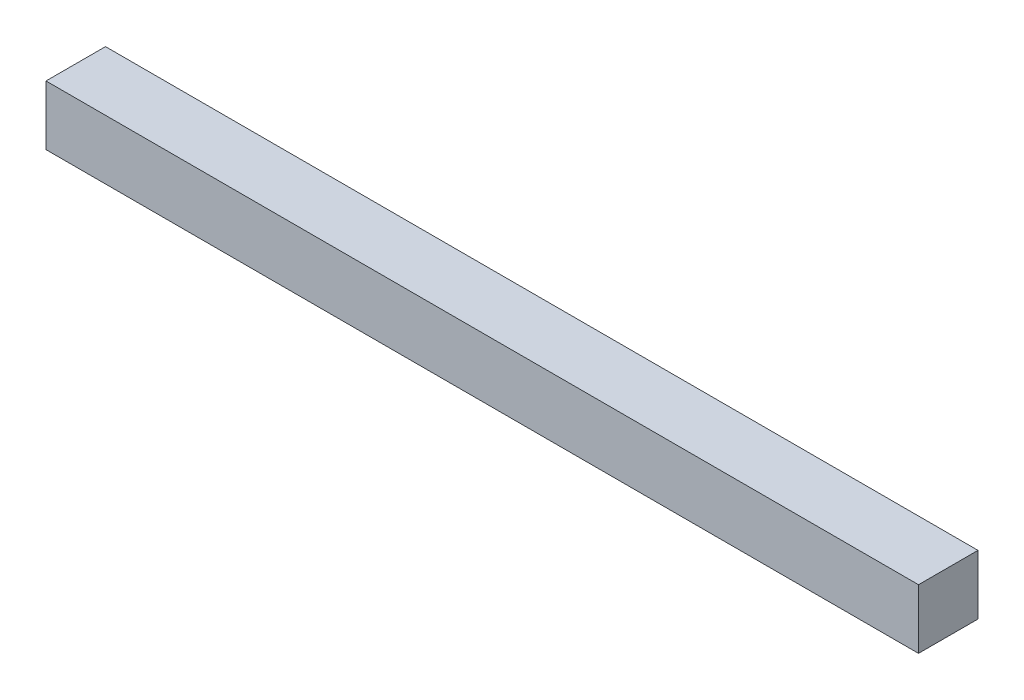
ISO-10303-21;
HEADER;
FILE_DESCRIPTION(('STEP AP214'),'2;1');
FILE_NAME('part.step','',(''),(''),'','','');
FILE_SCHEMA(('AUTOMOTIVE_DESIGN { 1 0 10303 214 1 1 1 1 }'));
ENDSEC;
DATA;
#1=APPLICATION_CONTEXT('core data for automotive mechanical design processes');
#2=APPLICATION_PROTOCOL_DEFINITION('international standard','automotive_design',2000,#1);
#3=PRODUCT_CONTEXT('',#1,'mechanical');
#4=PRODUCT('Part','Part','',(#3));
#5=PRODUCT_RELATED_PRODUCT_CATEGORY('part','',(#4));
#6=PRODUCT_DEFINITION_FORMATION('','',#4);
#7=PRODUCT_DEFINITION_CONTEXT('part definition',#1,'design');
#8=PRODUCT_DEFINITION('design','',#6,#7);
#9=PRODUCT_DEFINITION_SHAPE('','',#8);
#10=(LENGTH_UNIT() NAMED_UNIT(*) SI_UNIT(.MILLI.,.METRE.));
#11=(NAMED_UNIT(*) PLANE_ANGLE_UNIT() SI_UNIT($,.RADIAN.));
#12=(NAMED_UNIT(*) SI_UNIT($,.STERADIAN.) SOLID_ANGLE_UNIT());
#13=UNCERTAINTY_MEASURE_WITH_UNIT(LENGTH_MEASURE(1.E-05),#10,'distance_accuracy_value','');
#14=(GEOMETRIC_REPRESENTATION_CONTEXT(3) GLOBAL_UNCERTAINTY_ASSIGNED_CONTEXT((#13)) GLOBAL_UNIT_ASSIGNED_CONTEXT((#10,
#11,#12)) REPRESENTATION_CONTEXT('',''));
#15=CARTESIAN_POINT('',(0.,0.,0.));
#16=DIRECTION('',(0.,0.,1.));
#17=DIRECTION('',(1.,0.,0.));
#18=AXIS2_PLACEMENT_3D('',#15,#16,#17);
#19=CARTESIAN_POINT('',(0.,150.,150.));
#20=DIRECTION('',(1.,0.,0.));
#21=DIRECTION('',(0.,1.,0.));
#22=AXIS2_PLACEMENT_3D('',#19,#20,#21);
#23=PLANE('',#22);
#24=DIRECTION('',(0.,-1.,0.));
#25=VECTOR('',#24,1.);
#26=CARTESIAN_POINT('',(0.,150.,0.));
#27=LINE('',#26,#25);
#28=CARTESIAN_POINT('',(0.,150.,0.));
#29=VERTEX_POINT('',#28);
#30=CARTESIAN_POINT('',(0.,0.,0.));
#31=VERTEX_POINT('',#30);
#32=EDGE_CURVE('E95',#29,#31,#27,.T.);
#33=ORIENTED_EDGE('',*,*,#32,.T.);
#34=DIRECTION('',(0.,0.,-1.));
#35=VECTOR('',#34,1.);
#36=CARTESIAN_POINT('',(0.,0.,150.));
#37=LINE('',#36,#35);
#38=CARTESIAN_POINT('',(0.,0.,150.));
#39=VERTEX_POINT('',#38);
#40=EDGE_CURVE('E11',#39,#31,#37,.T.);
#41=ORIENTED_EDGE('',*,*,#40,.F.);
#42=DIRECTION('',(0.,-1.,0.));
#43=VECTOR('',#42,1.);
#44=CARTESIAN_POINT('',(0.,150.,150.));
#45=LINE('',#44,#43);
#46=CARTESIAN_POINT('',(0.,150.,150.));
#47=VERTEX_POINT('',#46);
#48=EDGE_CURVE('E83',#47,#39,#45,.T.);
#49=ORIENTED_EDGE('',*,*,#48,.F.);
#50=DIRECTION('',(0.,0.,-1.));
#51=VECTOR('',#50,1.);
#52=CARTESIAN_POINT('',(0.,150.,150.));
#53=LINE('',#52,#51);
#54=EDGE_CURVE('E91',#47,#29,#53,.T.);
#55=ORIENTED_EDGE('',*,*,#54,.T.);
#56=EDGE_LOOP('',(#33,#41,#49,#55));
#57=FACE_BOUND('',#56,.T.);
#58=ADVANCED_FACE('F32',(#57),#23,.F.);
#59=CARTESIAN_POINT('',(0.,0.,150.));
#60=DIRECTION('',(0.,1.,0.));
#61=DIRECTION('',(0.,0.,1.));
#62=AXIS2_PLACEMENT_3D('',#59,#60,#61);
#63=PLANE('',#62);
#64=DIRECTION('',(1.,0.,0.));
#65=VECTOR('',#64,1.);
#66=CARTESIAN_POINT('',(0.,0.,0.));
#67=LINE('',#66,#65);
#68=CARTESIAN_POINT('',(2200.,0.,0.));
#69=VERTEX_POINT('',#68);
#70=EDGE_CURVE('E87',#31,#69,#67,.T.);
#71=ORIENTED_EDGE('',*,*,#70,.T.);
#72=DIRECTION('',(0.,0.,-1.));
#73=VECTOR('',#72,1.);
#74=CARTESIAN_POINT('',(2200.,0.,150.));
#75=LINE('',#74,#73);
#76=CARTESIAN_POINT('',(2200.,0.,150.));
#77=VERTEX_POINT('',#76);
#78=EDGE_CURVE('E40',#77,#69,#75,.T.);
#79=ORIENTED_EDGE('',*,*,#78,.F.);
#80=DIRECTION('',(1.,0.,0.));
#81=VECTOR('',#80,1.);
#82=CARTESIAN_POINT('',(0.,0.,150.));
#83=LINE('',#82,#81);
#84=EDGE_CURVE('E78',#39,#77,#83,.T.);
#85=ORIENTED_EDGE('',*,*,#84,.F.);
#86=ORIENTED_EDGE('',*,*,#40,.T.);
#87=EDGE_LOOP('',(#71,#79,#85,#86));
#88=FACE_BOUND('',#87,.T.);
#89=ADVANCED_FACE('F86',(#88),#63,.F.);
#90=CARTESIAN_POINT('',(2200.,150.,150.));
#91=DIRECTION('',(-1.,0.,0.));
#92=DIRECTION('',(0.,0.,1.));
#93=AXIS2_PLACEMENT_3D('',#90,#91,#92);
#94=PLANE('',#93);
#95=DIRECTION('',(0.,1.,0.));
#96=VECTOR('',#95,1.);
#97=CARTESIAN_POINT('',(2200.,150.,0.));
#98=LINE('',#97,#96);
#99=CARTESIAN_POINT('',(2200.,150.,0.));
#100=VERTEX_POINT('',#99);
#101=EDGE_CURVE('E65',#69,#100,#98,.T.);
#102=ORIENTED_EDGE('',*,*,#101,.T.);
#103=DIRECTION('',(0.,0.,-1.));
#104=VECTOR('',#103,1.);
#105=CARTESIAN_POINT('',(2200.,150.,150.));
#106=LINE('',#105,#104);
#107=CARTESIAN_POINT('',(2200.,150.,150.));
#108=VERTEX_POINT('',#107);
#109=EDGE_CURVE('E88',#108,#100,#106,.T.);
#110=ORIENTED_EDGE('',*,*,#109,.F.);
#111=DIRECTION('',(0.,1.,0.));
#112=VECTOR('',#111,1.);
#113=CARTESIAN_POINT('',(2200.,150.,150.));
#114=LINE('',#113,#112);
#115=EDGE_CURVE('E81',#77,#108,#114,.T.);
#116=ORIENTED_EDGE('',*,*,#115,.F.);
#117=ORIENTED_EDGE('',*,*,#78,.T.);
#118=EDGE_LOOP('',(#102,#110,#116,#117));
#119=FACE_BOUND('',#118,.T.);
#120=ADVANCED_FACE('F89',(#119),#94,.F.);
#121=CARTESIAN_POINT('',(0.,150.,150.));
#122=DIRECTION('',(0.,-1.,0.));
#123=DIRECTION('',(0.,0.,-1.));
#124=AXIS2_PLACEMENT_3D('',#121,#122,#123);
#125=PLANE('',#124);
#126=DIRECTION('',(-1.,0.,0.));
#127=VECTOR('',#126,1.);
#128=CARTESIAN_POINT('',(0.,150.,0.));
#129=LINE('',#128,#127);
#130=EDGE_CURVE('E71',#100,#29,#129,.T.);
#131=ORIENTED_EDGE('',*,*,#130,.T.);
#132=ORIENTED_EDGE('',*,*,#54,.F.);
#133=DIRECTION('',(-1.,0.,0.));
#134=VECTOR('',#133,1.);
#135=CARTESIAN_POINT('',(0.,150.,150.));
#136=LINE('',#135,#134);
#137=EDGE_CURVE('E48',#108,#47,#136,.T.);
#138=ORIENTED_EDGE('',*,*,#137,.F.);
#139=ORIENTED_EDGE('',*,*,#109,.T.);
#140=EDGE_LOOP('',(#131,#132,#138,#139));
#141=FACE_BOUND('',#140,.T.);
#142=ADVANCED_FACE('F102',(#141),#125,.F.);
#143=CARTESIAN_POINT('',(0.,0.,150.));
#144=DIRECTION('',(0.,0.,1.));
#145=DIRECTION('',(1.,0.,0.));
#146=AXIS2_PLACEMENT_3D('',#143,#144,#145);
#147=PLANE('',#146);
#148=ORIENTED_EDGE('',*,*,#48,.T.);
#149=ORIENTED_EDGE('',*,*,#84,.T.);
#150=ORIENTED_EDGE('',*,*,#115,.T.);
#151=ORIENTED_EDGE('',*,*,#137,.T.);
#152=EDGE_LOOP('',(#148,#149,#150,#151));
#153=FACE_BOUND('',#152,.T.);
#154=ADVANCED_FACE('F79',(#153),#147,.T.);
#155=CARTESIAN_POINT('',(0.,0.,0.));
#156=DIRECTION('',(0.,0.,1.));
#157=DIRECTION('',(1.,0.,0.));
#158=AXIS2_PLACEMENT_3D('',#155,#156,#157);
#159=PLANE('',#158);
#160=ORIENTED_EDGE('',*,*,#32,.F.);
#161=ORIENTED_EDGE('',*,*,#130,.F.);
#162=ORIENTED_EDGE('',*,*,#101,.F.);
#163=ORIENTED_EDGE('',*,*,#70,.F.);
#164=EDGE_LOOP('',(#160,#161,#162,#163));
#165=FACE_BOUND('',#164,.T.);
#166=ADVANCED_FACE('F105',(#165),#159,.F.);
#167=CLOSED_SHELL('',(#58,#89,#120,#142,#154,#166));
#168=MANIFOLD_SOLID_BREP('B2',#167);
#169=ADVANCED_BREP_SHAPE_REPRESENTATION('',(#18,#168),#14);
#170=SHAPE_DEFINITION_REPRESENTATION(#9,#169);
ENDSEC;
END-ISO-10303-21;
